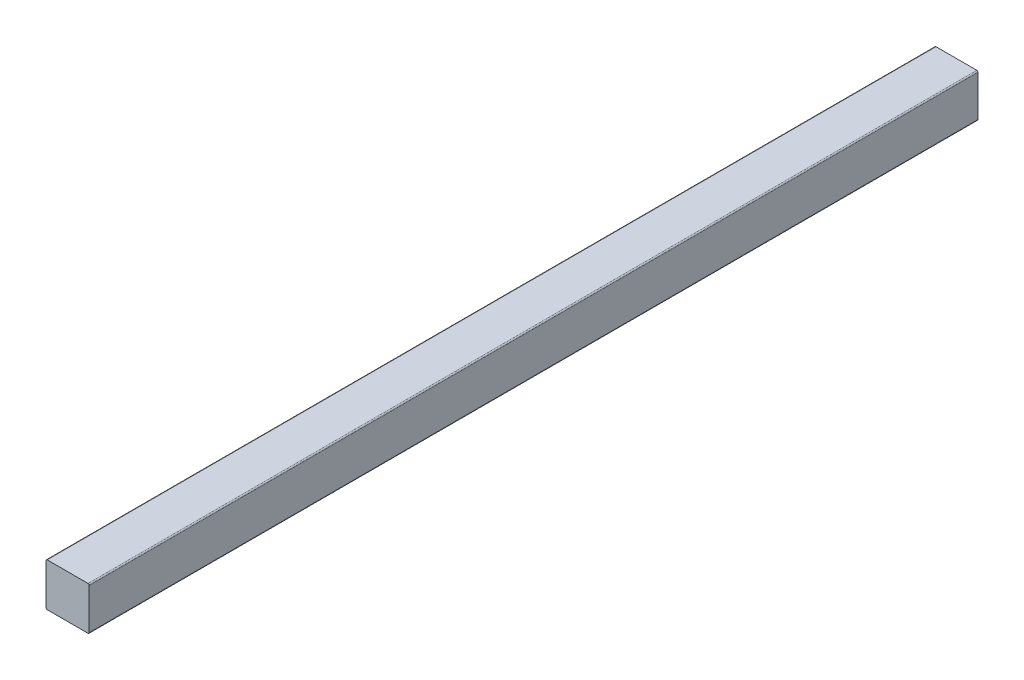
ISO-10303-21;
HEADER;
FILE_DESCRIPTION(('STEP AP214'),'2;1');
FILE_NAME('part.step','',(''),(''),'','','');
FILE_SCHEMA(('AUTOMOTIVE_DESIGN { 1 0 10303 214 1 1 1 1 }'));
ENDSEC;
DATA;
#1=APPLICATION_CONTEXT('core data for automotive mechanical design processes');
#2=APPLICATION_PROTOCOL_DEFINITION('international standard','automotive_design',2000,#1);
#3=PRODUCT_CONTEXT('',#1,'mechanical');
#4=PRODUCT('Part','Part','',(#3));
#5=PRODUCT_RELATED_PRODUCT_CATEGORY('part','',(#4));
#6=PRODUCT_DEFINITION_FORMATION('','',#4);
#7=PRODUCT_DEFINITION_CONTEXT('part definition',#1,'design');
#8=PRODUCT_DEFINITION('design','',#6,#7);
#9=PRODUCT_DEFINITION_SHAPE('','',#8);
#10=(LENGTH_UNIT() NAMED_UNIT(*) SI_UNIT(.MILLI.,.METRE.));
#11=(NAMED_UNIT(*) PLANE_ANGLE_UNIT() SI_UNIT($,.RADIAN.));
#12=(NAMED_UNIT(*) SI_UNIT($,.STERADIAN.) SOLID_ANGLE_UNIT());
#13=UNCERTAINTY_MEASURE_WITH_UNIT(LENGTH_MEASURE(1.E-05),#10,'distance_accuracy_value','');
#14=(GEOMETRIC_REPRESENTATION_CONTEXT(3) GLOBAL_UNCERTAINTY_ASSIGNED_CONTEXT((#13)) GLOBAL_UNIT_ASSIGNED_CONTEXT((#10,
#11,#12)) REPRESENTATION_CONTEXT('',''));
#15=CARTESIAN_POINT('',(0.,0.,0.));
#16=DIRECTION('',(0.,0.,1.));
#17=DIRECTION('',(1.,0.,0.));
#18=AXIS2_PLACEMENT_3D('',#15,#16,#17);
#19=CARTESIAN_POINT('',(41.91,41.91,914.4));
#20=DIRECTION('',(0.,0.,-1.));
#21=DIRECTION('',(-1.,0.,0.));
#22=AXIS2_PLACEMENT_3D('',#19,#20,#21);
#23=CYLINDRICAL_SURFACE('',#22,2.54);
#24=CARTESIAN_POINT('',(41.91,41.91,-914.4));
#25=DIRECTION('',(0.,0.,1.));
#26=DIRECTION('',(-1.,0.,0.));
#27=AXIS2_PLACEMENT_3D('',#24,#25,#26);
#28=CIRCLE('',#27,2.54);
#29=CARTESIAN_POINT('',(44.45,41.91,-914.4));
#30=VERTEX_POINT('',#29);
#31=CARTESIAN_POINT('',(41.91,44.45,-914.4));
#32=VERTEX_POINT('',#31);
#33=EDGE_CURVE('E129',#30,#32,#28,.T.);
#34=ORIENTED_EDGE('',*,*,#33,.T.);
#35=DIRECTION('',(0.,0.,-1.));
#36=VECTOR('',#35,1.);
#37=CARTESIAN_POINT('',(41.91,44.45,914.4));
#38=LINE('',#37,#36);
#39=CARTESIAN_POINT('',(41.91,44.45,914.4));
#40=VERTEX_POINT('',#39);
#41=EDGE_CURVE('E11',#40,#32,#38,.T.);
#42=ORIENTED_EDGE('',*,*,#41,.F.);
#43=CARTESIAN_POINT('',(41.91,41.91,914.4));
#44=DIRECTION('',(0.,0.,1.));
#45=DIRECTION('',(-1.,0.,0.));
#46=AXIS2_PLACEMENT_3D('',#43,#44,#45);
#47=CIRCLE('',#46,2.54);
#48=CARTESIAN_POINT('',(44.45,41.91,914.4));
#49=VERTEX_POINT('',#48);
#50=EDGE_CURVE('E143',#49,#40,#47,.T.);
#51=ORIENTED_EDGE('',*,*,#50,.F.);
#52=DIRECTION('',(0.,0.,-1.));
#53=VECTOR('',#52,1.);
#54=CARTESIAN_POINT('',(44.45,41.91,914.4));
#55=LINE('',#54,#53);
#56=EDGE_CURVE('E125',#49,#30,#55,.T.);
#57=ORIENTED_EDGE('',*,*,#56,.T.);
#58=EDGE_LOOP('',(#34,#42,#51,#57));
#59=FACE_BOUND('',#58,.T.);
#60=ADVANCED_FACE('F33',(#59),#23,.T.);
#61=CARTESIAN_POINT('',(-41.91,44.45,914.4));
#62=DIRECTION('',(0.,-1.,0.));
#63=DIRECTION('',(0.,0.,-1.));
#64=AXIS2_PLACEMENT_3D('',#61,#62,#63);
#65=PLANE('',#64);
#66=DIRECTION('',(-1.,0.,0.));
#67=VECTOR('',#66,1.);
#68=CARTESIAN_POINT('',(-41.91,44.45,-914.4));
#69=LINE('',#68,#67);
#70=CARTESIAN_POINT('',(-41.91,44.45,-914.4));
#71=VERTEX_POINT('',#70);
#72=EDGE_CURVE('E132',#32,#71,#69,.T.);
#73=ORIENTED_EDGE('',*,*,#72,.T.);
#74=DIRECTION('',(0.,0.,-1.));
#75=VECTOR('',#74,1.);
#76=CARTESIAN_POINT('',(-41.91,44.45,914.4));
#77=LINE('',#76,#75);
#78=CARTESIAN_POINT('',(-41.91,44.45,914.4));
#79=VERTEX_POINT('',#78);
#80=EDGE_CURVE('E41',#79,#71,#77,.T.);
#81=ORIENTED_EDGE('',*,*,#80,.F.);
#82=DIRECTION('',(-1.,0.,0.));
#83=VECTOR('',#82,1.);
#84=CARTESIAN_POINT('',(-41.91,44.45,914.4));
#85=LINE('',#84,#83);
#86=EDGE_CURVE('E92',#40,#79,#85,.T.);
#87=ORIENTED_EDGE('',*,*,#86,.F.);
#88=ORIENTED_EDGE('',*,*,#41,.T.);
#89=EDGE_LOOP('',(#73,#81,#87,#88));
#90=FACE_BOUND('',#89,.T.);
#91=ADVANCED_FACE('F178',(#90),#65,.F.);
#92=CARTESIAN_POINT('',(-41.91,41.91,914.4));
#93=DIRECTION('',(0.,0.,-1.));
#94=DIRECTION('',(-1.,0.,0.));
#95=AXIS2_PLACEMENT_3D('',#92,#93,#94);
#96=CYLINDRICAL_SURFACE('',#95,2.54);
#97=CARTESIAN_POINT('',(-41.91,41.91,-914.4));
#98=DIRECTION('',(0.,0.,1.));
#99=DIRECTION('',(1.,0.,0.));
#100=AXIS2_PLACEMENT_3D('',#97,#98,#99);
#101=CIRCLE('',#100,2.54);
#102=CARTESIAN_POINT('',(-44.45,41.91,-914.4));
#103=VERTEX_POINT('',#102);
#104=EDGE_CURVE('E134',#71,#103,#101,.T.);
#105=ORIENTED_EDGE('',*,*,#104,.T.);
#106=DIRECTION('',(0.,0.,-1.));
#107=VECTOR('',#106,1.);
#108=CARTESIAN_POINT('',(-44.45,41.91,914.4));
#109=LINE('',#108,#107);
#110=CARTESIAN_POINT('',(-44.45,41.91,914.4));
#111=VERTEX_POINT('',#110);
#112=EDGE_CURVE('E150',#111,#103,#109,.T.);
#113=ORIENTED_EDGE('',*,*,#112,.F.);
#114=CARTESIAN_POINT('',(-41.91,41.91,914.4));
#115=DIRECTION('',(0.,0.,1.));
#116=DIRECTION('',(1.,0.,0.));
#117=AXIS2_PLACEMENT_3D('',#114,#115,#116);
#118=CIRCLE('',#117,2.54);
#119=EDGE_CURVE('E158',#79,#111,#118,.T.);
#120=ORIENTED_EDGE('',*,*,#119,.F.);
#121=ORIENTED_EDGE('',*,*,#80,.T.);
#122=EDGE_LOOP('',(#105,#113,#120,#121));
#123=FACE_BOUND('',#122,.T.);
#124=ADVANCED_FACE('F156',(#123),#96,.T.);
#125=CARTESIAN_POINT('',(-44.45,41.91,914.4));
#126=DIRECTION('',(1.,0.,0.));
#127=DIRECTION('',(0.,1.,0.));
#128=AXIS2_PLACEMENT_3D('',#125,#126,#127);
#129=PLANE('',#128);
#130=DIRECTION('',(0.,-1.,0.));
#131=VECTOR('',#130,1.);
#132=CARTESIAN_POINT('',(-44.45,41.91,-914.4));
#133=LINE('',#132,#131);
#134=CARTESIAN_POINT('',(-44.45,-41.91,-914.4));
#135=VERTEX_POINT('',#134);
#136=EDGE_CURVE('E136',#103,#135,#133,.T.);
#137=ORIENTED_EDGE('',*,*,#136,.T.);
#138=DIRECTION('',(0.,0.,-1.));
#139=VECTOR('',#138,1.);
#140=CARTESIAN_POINT('',(-44.45,-41.91,914.4));
#141=LINE('',#140,#139);
#142=CARTESIAN_POINT('',(-44.45,-41.91,914.4));
#143=VERTEX_POINT('',#142);
#144=EDGE_CURVE('E147',#143,#135,#141,.T.);
#145=ORIENTED_EDGE('',*,*,#144,.F.);
#146=DIRECTION('',(0.,-1.,0.));
#147=VECTOR('',#146,1.);
#148=CARTESIAN_POINT('',(-44.45,41.91,914.4));
#149=LINE('',#148,#147);
#150=EDGE_CURVE('E170',#111,#143,#149,.T.);
#151=ORIENTED_EDGE('',*,*,#150,.F.);
#152=ORIENTED_EDGE('',*,*,#112,.T.);
#153=EDGE_LOOP('',(#137,#145,#151,#152));
#154=FACE_BOUND('',#153,.T.);
#155=ADVANCED_FACE('F166',(#154),#129,.F.);
#156=CARTESIAN_POINT('',(-41.91,-41.91,914.4));
#157=DIRECTION('',(0.,0.,-1.));
#158=DIRECTION('',(-1.,0.,0.));
#159=AXIS2_PLACEMENT_3D('',#156,#157,#158);
#160=CYLINDRICAL_SURFACE('',#159,2.54);
#161=CARTESIAN_POINT('',(-41.91,-41.91,-914.4));
#162=DIRECTION('',(0.,0.,1.));
#163=DIRECTION('',(1.,0.,0.));
#164=AXIS2_PLACEMENT_3D('',#161,#162,#163);
#165=CIRCLE('',#164,2.54);
#166=CARTESIAN_POINT('',(-41.91,-44.45,-914.4));
#167=VERTEX_POINT('',#166);
#168=EDGE_CURVE('E138',#135,#167,#165,.T.);
#169=ORIENTED_EDGE('',*,*,#168,.T.);
#170=DIRECTION('',(0.,0.,-1.));
#171=VECTOR('',#170,1.);
#172=CARTESIAN_POINT('',(-41.91,-44.45,914.4));
#173=LINE('',#172,#171);
#174=CARTESIAN_POINT('',(-41.91,-44.45,914.4));
#175=VERTEX_POINT('',#174);
#176=EDGE_CURVE('E120',#175,#167,#173,.T.);
#177=ORIENTED_EDGE('',*,*,#176,.F.);
#178=CARTESIAN_POINT('',(-41.91,-41.91,914.4));
#179=DIRECTION('',(0.,0.,1.));
#180=DIRECTION('',(1.,0.,0.));
#181=AXIS2_PLACEMENT_3D('',#178,#179,#180);
#182=CIRCLE('',#181,2.54);
#183=EDGE_CURVE('E111',#143,#175,#182,.T.);
#184=ORIENTED_EDGE('',*,*,#183,.F.);
#185=ORIENTED_EDGE('',*,*,#144,.T.);
#186=EDGE_LOOP('',(#169,#177,#184,#185));
#187=FACE_BOUND('',#186,.T.);
#188=ADVANCED_FACE('F169',(#187),#160,.T.);
#189=CARTESIAN_POINT('',(-41.91,-44.45,914.4));
#190=DIRECTION('',(0.,1.,0.));
#191=DIRECTION('',(-1.,0.,0.));
#192=AXIS2_PLACEMENT_3D('',#189,#190,#191);
#193=PLANE('',#192);
#194=DIRECTION('',(1.,0.,0.));
#195=VECTOR('',#194,1.);
#196=CARTESIAN_POINT('',(-41.91,-44.45,-914.4));
#197=LINE('',#196,#195);
#198=CARTESIAN_POINT('',(41.91,-44.45,-914.4));
#199=VERTEX_POINT('',#198);
#200=EDGE_CURVE('E119',#167,#199,#197,.T.);
#201=ORIENTED_EDGE('',*,*,#200,.T.);
#202=DIRECTION('',(0.,0.,-1.));
#203=VECTOR('',#202,1.);
#204=CARTESIAN_POINT('',(41.91,-44.45,914.4));
#205=LINE('',#204,#203);
#206=CARTESIAN_POINT('',(41.91,-44.45,914.4));
#207=VERTEX_POINT('',#206);
#208=EDGE_CURVE('E116',#207,#199,#205,.T.);
#209=ORIENTED_EDGE('',*,*,#208,.F.);
#210=DIRECTION('',(1.,0.,0.));
#211=VECTOR('',#210,1.);
#212=CARTESIAN_POINT('',(-41.91,-44.45,914.4));
#213=LINE('',#212,#211);
#214=EDGE_CURVE('E105',#175,#207,#213,.T.);
#215=ORIENTED_EDGE('',*,*,#214,.F.);
#216=ORIENTED_EDGE('',*,*,#176,.T.);
#217=EDGE_LOOP('',(#201,#209,#215,#216));
#218=FACE_BOUND('',#217,.T.);
#219=ADVANCED_FACE('F117',(#218),#193,.F.);
#220=CARTESIAN_POINT('',(41.91,-41.91,914.4));
#221=DIRECTION('',(0.,0.,-1.));
#222=DIRECTION('',(-1.,0.,0.));
#223=AXIS2_PLACEMENT_3D('',#220,#221,#222);
#224=CYLINDRICAL_SURFACE('',#223,2.54000000000001);
#225=CARTESIAN_POINT('',(41.91,-41.91,-914.4));
#226=DIRECTION('',(0.,0.,1.));
#227=DIRECTION('',(1.,0.,0.));
#228=AXIS2_PLACEMENT_3D('',#225,#226,#227);
#229=CIRCLE('',#228,2.54000000000001);
#230=CARTESIAN_POINT('',(44.45,-41.91,-914.4));
#231=VERTEX_POINT('',#230);
#232=EDGE_CURVE('E78',#199,#231,#229,.T.);
#233=ORIENTED_EDGE('',*,*,#232,.T.);
#234=DIRECTION('',(0.,0.,-1.));
#235=VECTOR('',#234,1.);
#236=CARTESIAN_POINT('',(44.45,-41.91,914.4));
#237=LINE('',#236,#235);
#238=CARTESIAN_POINT('',(44.45,-41.91,914.4));
#239=VERTEX_POINT('',#238);
#240=EDGE_CURVE('E121',#239,#231,#237,.T.);
#241=ORIENTED_EDGE('',*,*,#240,.F.);
#242=CARTESIAN_POINT('',(41.91,-41.91,914.4));
#243=DIRECTION('',(0.,0.,1.));
#244=DIRECTION('',(1.,0.,0.));
#245=AXIS2_PLACEMENT_3D('',#242,#243,#244);
#246=CIRCLE('',#245,2.54000000000001);
#247=EDGE_CURVE('E109',#207,#239,#246,.T.);
#248=ORIENTED_EDGE('',*,*,#247,.F.);
#249=ORIENTED_EDGE('',*,*,#208,.T.);
#250=EDGE_LOOP('',(#233,#241,#248,#249));
#251=FACE_BOUND('',#250,.T.);
#252=ADVANCED_FACE('F123',(#251),#224,.T.);
#253=CARTESIAN_POINT('',(44.45,41.91,914.4));
#254=DIRECTION('',(-1.,0.,0.));
#255=DIRECTION('',(0.,-1.,0.));
#256=AXIS2_PLACEMENT_3D('',#253,#254,#255);
#257=PLANE('',#256);
#258=DIRECTION('',(0.,1.,0.));
#259=VECTOR('',#258,1.);
#260=CARTESIAN_POINT('',(44.45,41.91,-914.4));
#261=LINE('',#260,#259);
#262=EDGE_CURVE('E84',#231,#30,#261,.T.);
#263=ORIENTED_EDGE('',*,*,#262,.T.);
#264=ORIENTED_EDGE('',*,*,#56,.F.);
#265=DIRECTION('',(0.,1.,0.));
#266=VECTOR('',#265,1.);
#267=CARTESIAN_POINT('',(44.45,41.91,914.4));
#268=LINE('',#267,#266);
#269=EDGE_CURVE('E49',#239,#49,#268,.T.);
#270=ORIENTED_EDGE('',*,*,#269,.F.);
#271=ORIENTED_EDGE('',*,*,#240,.T.);
#272=EDGE_LOOP('',(#263,#264,#270,#271));
#273=FACE_BOUND('',#272,.T.);
#274=ADVANCED_FACE('F194',(#273),#257,.F.);
#275=CARTESIAN_POINT('',(41.91,41.91,914.4));
#276=DIRECTION('',(0.,0.,-1.));
#277=DIRECTION('',(-1.,0.,0.));
#278=AXIS2_PLACEMENT_3D('',#275,#276,#277);
#279=PLANE('',#278);
#280=ORIENTED_EDGE('',*,*,#50,.T.);
#281=ORIENTED_EDGE('',*,*,#86,.T.);
#282=ORIENTED_EDGE('',*,*,#119,.T.);
#283=ORIENTED_EDGE('',*,*,#150,.T.);
#284=ORIENTED_EDGE('',*,*,#183,.T.);
#285=ORIENTED_EDGE('',*,*,#214,.T.);
#286=ORIENTED_EDGE('',*,*,#247,.T.);
#287=ORIENTED_EDGE('',*,*,#269,.T.);
#288=EDGE_LOOP('',(#280,#281,#282,#283,#284,#285,#286,#287));
#289=FACE_BOUND('',#288,.T.);
#290=ADVANCED_FACE('F107',(#289),#279,.F.);
#291=CARTESIAN_POINT('',(41.91,41.91,-914.4));
#292=DIRECTION('',(0.,0.,-1.));
#293=DIRECTION('',(-1.,0.,0.));
#294=AXIS2_PLACEMENT_3D('',#291,#292,#293);
#295=PLANE('',#294);
#296=ORIENTED_EDGE('',*,*,#33,.F.);
#297=ORIENTED_EDGE('',*,*,#262,.F.);
#298=ORIENTED_EDGE('',*,*,#232,.F.);
#299=ORIENTED_EDGE('',*,*,#200,.F.);
#300=ORIENTED_EDGE('',*,*,#168,.F.);
#301=ORIENTED_EDGE('',*,*,#136,.F.);
#302=ORIENTED_EDGE('',*,*,#104,.F.);
#303=ORIENTED_EDGE('',*,*,#72,.F.);
#304=EDGE_LOOP('',(#296,#297,#298,#299,#300,#301,#302,#303));
#305=FACE_BOUND('',#304,.T.);
#306=ADVANCED_FACE('F162',(#305),#295,.T.);
#307=CLOSED_SHELL('',(#60,#91,#124,#155,#188,#219,#252,#274,#290,#306));
#308=MANIFOLD_SOLID_BREP('B2',#307);
#309=ADVANCED_BREP_SHAPE_REPRESENTATION('',(#18,#308),#14);
#310=SHAPE_DEFINITION_REPRESENTATION(#9,#309);
ENDSEC;
END-ISO-10303-21;
